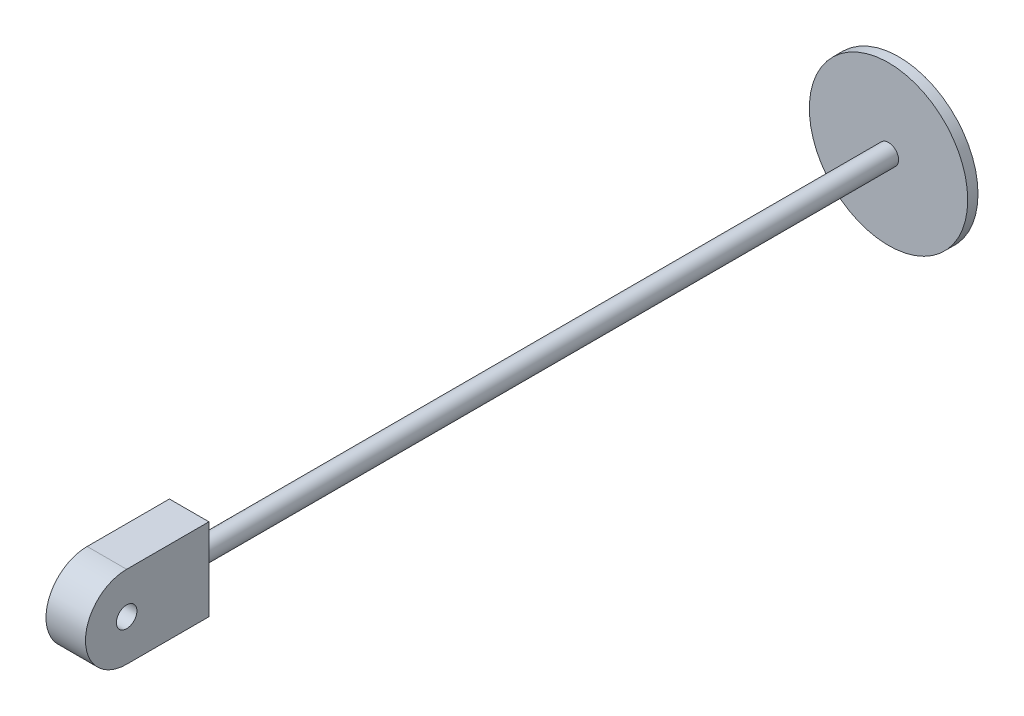
ISO-10303-21;
HEADER;
FILE_DESCRIPTION(('STEP AP214'),'2;1');
FILE_NAME('part.step','',(''),(''),'','','');
FILE_SCHEMA(('AUTOMOTIVE_DESIGN { 1 0 10303 214 1 1 1 1 }'));
ENDSEC;
DATA;
#1=APPLICATION_CONTEXT('core data for automotive mechanical design processes');
#2=APPLICATION_PROTOCOL_DEFINITION('international standard','automotive_design',2000,#1);
#3=PRODUCT_CONTEXT('',#1,'mechanical');
#4=PRODUCT('Part','Part','',(#3));
#5=PRODUCT_RELATED_PRODUCT_CATEGORY('part','',(#4));
#6=PRODUCT_DEFINITION_FORMATION('','',#4);
#7=PRODUCT_DEFINITION_CONTEXT('part definition',#1,'design');
#8=PRODUCT_DEFINITION('design','',#6,#7);
#9=PRODUCT_DEFINITION_SHAPE('','',#8);
#10=(LENGTH_UNIT() NAMED_UNIT(*) SI_UNIT(.MILLI.,.METRE.));
#11=(NAMED_UNIT(*) PLANE_ANGLE_UNIT() SI_UNIT($,.RADIAN.));
#12=(NAMED_UNIT(*) SI_UNIT($,.STERADIAN.) SOLID_ANGLE_UNIT());
#13=UNCERTAINTY_MEASURE_WITH_UNIT(LENGTH_MEASURE(1.E-05),#10,'distance_accuracy_value','');
#14=(GEOMETRIC_REPRESENTATION_CONTEXT(3) GLOBAL_UNCERTAINTY_ASSIGNED_CONTEXT((#13)) GLOBAL_UNIT_ASSIGNED_CONTEXT((#10,
#11,#12)) REPRESENTATION_CONTEXT('',''));
#15=CARTESIAN_POINT('',(0.,0.,0.));
#16=DIRECTION('',(0.,0.,1.));
#17=DIRECTION('',(1.,0.,0.));
#18=AXIS2_PLACEMENT_3D('',#15,#16,#17);
#19=CARTESIAN_POINT('',(0.,0.,0.625));
#20=DIRECTION('',(0.,0.,-1.));
#21=DIRECTION('',(-1.,0.,0.));
#22=AXIS2_PLACEMENT_3D('',#19,#20,#21);
#23=CYLINDRICAL_SURFACE('',#22,9.625);
#24=CARTESIAN_POINT('',(0.,0.,0.625));
#25=DIRECTION('',(0.,0.,1.));
#26=DIRECTION('',(1.,0.,0.));
#27=AXIS2_PLACEMENT_3D('',#24,#25,#26);
#28=CIRCLE('',#27,9.625);
#29=CARTESIAN_POINT('',(9.625,0.,0.625));
#30=VERTEX_POINT('',#29);
#31=EDGE_CURVE('E11',#30,#30,#28,.T.);
#32=ORIENTED_EDGE('',*,*,#31,.F.);
#33=EDGE_LOOP('',(#32));
#34=FACE_BOUND('',#33,.T.);
#35=CARTESIAN_POINT('',(0.,0.,-0.625));
#36=DIRECTION('',(0.,0.,1.));
#37=DIRECTION('',(1.,0.,0.));
#38=AXIS2_PLACEMENT_3D('',#35,#36,#37);
#39=CIRCLE('',#38,9.625);
#40=CARTESIAN_POINT('',(9.625,0.,-0.625));
#41=VERTEX_POINT('',#40);
#42=EDGE_CURVE('E36',#41,#41,#39,.T.);
#43=ORIENTED_EDGE('',*,*,#42,.T.);
#44=EDGE_LOOP('',(#43));
#45=FACE_BOUND('',#44,.T.);
#46=ADVANCED_FACE('F33',(#34,#45),#23,.T.);
#47=CARTESIAN_POINT('',(0.,0.,0.625));
#48=DIRECTION('',(0.,0.,1.));
#49=DIRECTION('',(1.,0.,0.));
#50=AXIS2_PLACEMENT_3D('',#47,#48,#49);
#51=PLANE('',#50);
#52=CARTESIAN_POINT('',(0.,0.,0.625));
#53=DIRECTION('',(0.,0.,1.));
#54=DIRECTION('',(1.,0.,0.));
#55=AXIS2_PLACEMENT_3D('',#52,#53,#54);
#56=CIRCLE('',#55,1.225);
#57=CARTESIAN_POINT('',(1.225,0.,0.625));
#58=VERTEX_POINT('',#57);
#59=EDGE_CURVE('E110',#58,#58,#56,.T.);
#60=ORIENTED_EDGE('',*,*,#59,.F.);
#61=EDGE_LOOP('',(#60));
#62=FACE_BOUND('',#61,.T.);
#63=ORIENTED_EDGE('',*,*,#31,.T.);
#64=EDGE_LOOP('',(#63));
#65=FACE_BOUND('',#64,.T.);
#66=ADVANCED_FACE('F119',(#62,#65),#51,.T.);
#67=CARTESIAN_POINT('',(0.,0.,-0.625));
#68=DIRECTION('',(0.,0.,1.));
#69=DIRECTION('',(1.,0.,0.));
#70=AXIS2_PLACEMENT_3D('',#67,#68,#69);
#71=PLANE('',#70);
#72=ORIENTED_EDGE('',*,*,#42,.F.);
#73=EDGE_LOOP('',(#72));
#74=FACE_BOUND('',#73,.T.);
#75=ADVANCED_FACE('F122',(#74),#71,.F.);
#76=CARTESIAN_POINT('',(0.,0.,85.625));
#77=DIRECTION('',(0.,0.,-1.));
#78=DIRECTION('',(-1.,0.,0.));
#79=AXIS2_PLACEMENT_3D('',#76,#77,#78);
#80=CYLINDRICAL_SURFACE('',#79,1.225);
#81=CARTESIAN_POINT('',(0.,0.,85.625));
#82=DIRECTION('',(0.,0.,1.));
#83=DIRECTION('',(1.,0.,0.));
#84=AXIS2_PLACEMENT_3D('',#81,#82,#83);
#85=CIRCLE('',#84,1.225);
#86=CARTESIAN_POINT('',(1.225,0.,85.625));
#87=VERTEX_POINT('',#86);
#88=EDGE_CURVE('E111',#87,#87,#85,.T.);
#89=ORIENTED_EDGE('',*,*,#88,.F.);
#90=EDGE_LOOP('',(#89));
#91=FACE_BOUND('',#90,.T.);
#92=ORIENTED_EDGE('',*,*,#59,.T.);
#93=EDGE_LOOP('',(#92));
#94=FACE_BOUND('',#93,.T.);
#95=ADVANCED_FACE('F117',(#91,#94),#80,.T.);
#96=CARTESIAN_POINT('',(2.4,5.,85.625));
#97=DIRECTION('',(0.,-1.,0.));
#98=DIRECTION('',(0.,0.,-1.));
#99=AXIS2_PLACEMENT_3D('',#96,#97,#98);
#100=PLANE('',#99);
#101=DIRECTION('',(0.,0.,1.));
#102=VECTOR('',#101,1.);
#103=CARTESIAN_POINT('',(-2.4,5.,85.625));
#104=LINE('',#103,#102);
#105=CARTESIAN_POINT('',(-2.4,5.,85.625));
#106=VERTEX_POINT('',#105);
#107=CARTESIAN_POINT('',(-2.4,4.99999999999999,95.625));
#108=VERTEX_POINT('',#107);
#109=EDGE_CURVE('E100',#106,#108,#104,.T.);
#110=ORIENTED_EDGE('',*,*,#109,.T.);
#111=DIRECTION('',(-1.,0.,0.));
#112=VECTOR('',#111,1.);
#113=CARTESIAN_POINT('',(2.4,4.99999999999999,95.625));
#114=LINE('',#113,#112);
#115=CARTESIAN_POINT('',(2.4,4.99999999999999,95.625));
#116=VERTEX_POINT('',#115);
#117=EDGE_CURVE('E91',#116,#108,#114,.T.);
#118=ORIENTED_EDGE('',*,*,#117,.F.);
#119=DIRECTION('',(0.,0.,1.));
#120=VECTOR('',#119,1.);
#121=CARTESIAN_POINT('',(2.4,5.,85.625));
#122=LINE('',#121,#120);
#123=CARTESIAN_POINT('',(2.4,5.,85.625));
#124=VERTEX_POINT('',#123);
#125=EDGE_CURVE('E85',#124,#116,#122,.T.);
#126=ORIENTED_EDGE('',*,*,#125,.F.);
#127=DIRECTION('',(-1.,0.,0.));
#128=VECTOR('',#127,1.);
#129=CARTESIAN_POINT('',(2.4,5.,85.625));
#130=LINE('',#129,#128);
#131=EDGE_CURVE('E96',#124,#106,#130,.T.);
#132=ORIENTED_EDGE('',*,*,#131,.T.);
#133=EDGE_LOOP('',(#110,#118,#126,#132));
#134=FACE_BOUND('',#133,.T.);
#135=ADVANCED_FACE('F135',(#134),#100,.F.);
#136=CARTESIAN_POINT('',(2.4,0.,95.625));
#137=DIRECTION('',(-1.,0.,0.));
#138=DIRECTION('',(0.,0.,1.));
#139=AXIS2_PLACEMENT_3D('',#136,#137,#138);
#140=CYLINDRICAL_SURFACE('',#139,5.);
#141=CARTESIAN_POINT('',(-2.4,0.,95.625));
#142=DIRECTION('',(1.,0.,0.));
#143=DIRECTION('',(0.,0.,-1.));
#144=AXIS2_PLACEMENT_3D('',#141,#142,#143);
#145=CIRCLE('',#144,5.);
#146=CARTESIAN_POINT('',(-2.4,-5.,95.625));
#147=VERTEX_POINT('',#146);
#148=EDGE_CURVE('E90',#108,#147,#145,.T.);
#149=ORIENTED_EDGE('',*,*,#148,.T.);
#150=DIRECTION('',(-1.,0.,0.));
#151=VECTOR('',#150,1.);
#152=CARTESIAN_POINT('',(2.4,-5.,95.625));
#153=LINE('',#152,#151);
#154=CARTESIAN_POINT('',(2.4,-5.,95.625));
#155=VERTEX_POINT('',#154);
#156=EDGE_CURVE('E88',#155,#147,#153,.T.);
#157=ORIENTED_EDGE('',*,*,#156,.F.);
#158=CARTESIAN_POINT('',(2.4,0.,95.625));
#159=DIRECTION('',(1.,0.,0.));
#160=DIRECTION('',(0.,0.,-1.));
#161=AXIS2_PLACEMENT_3D('',#158,#159,#160);
#162=CIRCLE('',#161,5.);
#163=EDGE_CURVE('E80',#116,#155,#162,.T.);
#164=ORIENTED_EDGE('',*,*,#163,.F.);
#165=ORIENTED_EDGE('',*,*,#117,.T.);
#166=EDGE_LOOP('',(#149,#157,#164,#165));
#167=FACE_BOUND('',#166,.T.);
#168=ADVANCED_FACE('F89',(#167),#140,.T.);
#169=CARTESIAN_POINT('',(2.4,-5.,95.625));
#170=DIRECTION('',(0.,1.,0.));
#171=DIRECTION('',(0.,0.,1.));
#172=AXIS2_PLACEMENT_3D('',#169,#170,#171);
#173=PLANE('',#172);
#174=DIRECTION('',(0.,0.,-1.));
#175=VECTOR('',#174,1.);
#176=CARTESIAN_POINT('',(-2.4,-5.,95.625));
#177=LINE('',#176,#175);
#178=CARTESIAN_POINT('',(-2.4,-5.,85.625));
#179=VERTEX_POINT('',#178);
#180=EDGE_CURVE('E66',#147,#179,#177,.T.);
#181=ORIENTED_EDGE('',*,*,#180,.T.);
#182=DIRECTION('',(-1.,0.,0.));
#183=VECTOR('',#182,1.);
#184=CARTESIAN_POINT('',(2.4,-5.,85.625));
#185=LINE('',#184,#183);
#186=CARTESIAN_POINT('',(2.4,-5.,85.625));
#187=VERTEX_POINT('',#186);
#188=EDGE_CURVE('E92',#187,#179,#185,.T.);
#189=ORIENTED_EDGE('',*,*,#188,.F.);
#190=DIRECTION('',(0.,0.,-1.));
#191=VECTOR('',#190,1.);
#192=CARTESIAN_POINT('',(2.4,-5.,95.625));
#193=LINE('',#192,#191);
#194=EDGE_CURVE('E83',#155,#187,#193,.T.);
#195=ORIENTED_EDGE('',*,*,#194,.F.);
#196=ORIENTED_EDGE('',*,*,#156,.T.);
#197=EDGE_LOOP('',(#181,#189,#195,#196));
#198=FACE_BOUND('',#197,.T.);
#199=ADVANCED_FACE('F94',(#198),#173,.F.);
#200=CARTESIAN_POINT('',(2.4,5.,85.625));
#201=DIRECTION('',(0.,0.,1.));
#202=DIRECTION('',(1.,0.,0.));
#203=AXIS2_PLACEMENT_3D('',#200,#201,#202);
#204=PLANE('',#203);
#205=ORIENTED_EDGE('',*,*,#88,.T.);
#206=EDGE_LOOP('',(#205));
#207=FACE_BOUND('',#206,.T.);
#208=DIRECTION('',(0.,1.,0.));
#209=VECTOR('',#208,1.);
#210=CARTESIAN_POINT('',(-2.4,5.,85.625));
#211=LINE('',#210,#209);
#212=EDGE_CURVE('E72',#179,#106,#211,.T.);
#213=ORIENTED_EDGE('',*,*,#212,.T.);
#214=ORIENTED_EDGE('',*,*,#131,.F.);
#215=DIRECTION('',(0.,1.,0.));
#216=VECTOR('',#215,1.);
#217=CARTESIAN_POINT('',(2.4,5.,85.625));
#218=LINE('',#217,#216);
#219=EDGE_CURVE('E49',#187,#124,#218,.T.);
#220=ORIENTED_EDGE('',*,*,#219,.F.);
#221=ORIENTED_EDGE('',*,*,#188,.T.);
#222=EDGE_LOOP('',(#213,#214,#220,#221));
#223=FACE_BOUND('',#222,.T.);
#224=ADVANCED_FACE('F146',(#207,#223),#204,.F.);
#225=CARTESIAN_POINT('',(2.4,0.,95.625));
#226=DIRECTION('',(1.,0.,0.));
#227=DIRECTION('',(0.,0.,-1.));
#228=AXIS2_PLACEMENT_3D('',#225,#226,#227);
#229=PLANE('',#228);
#230=CARTESIAN_POINT('',(2.4,0.,95.625));
#231=DIRECTION('',(1.,0.,0.));
#232=DIRECTION('',(0.,0.,-1.));
#233=AXIS2_PLACEMENT_3D('',#230,#231,#232);
#234=CIRCLE('',#233,1.25);
#235=CARTESIAN_POINT('',(2.4,0.,94.375));
#236=VERTEX_POINT('',#235);
#237=EDGE_CURVE('E103',#236,#236,#234,.T.);
#238=ORIENTED_EDGE('',*,*,#237,.F.);
#239=EDGE_LOOP('',(#238));
#240=FACE_BOUND('',#239,.T.);
#241=ORIENTED_EDGE('',*,*,#125,.T.);
#242=ORIENTED_EDGE('',*,*,#163,.T.);
#243=ORIENTED_EDGE('',*,*,#194,.T.);
#244=ORIENTED_EDGE('',*,*,#219,.T.);
#245=EDGE_LOOP('',(#241,#242,#243,#244));
#246=FACE_BOUND('',#245,.T.);
#247=ADVANCED_FACE('F81',(#240,#246),#229,.T.);
#248=CARTESIAN_POINT('',(-2.4,0.,95.625));
#249=DIRECTION('',(1.,0.,0.));
#250=DIRECTION('',(0.,0.,-1.));
#251=AXIS2_PLACEMENT_3D('',#248,#249,#250);
#252=PLANE('',#251);
#253=CARTESIAN_POINT('',(-2.4,0.,95.625));
#254=DIRECTION('',(-1.,0.,0.));
#255=DIRECTION('',(0.,0.,1.));
#256=AXIS2_PLACEMENT_3D('',#253,#254,#255);
#257=CIRCLE('',#256,1.25);
#258=CARTESIAN_POINT('',(-2.4,0.,96.875));
#259=VERTEX_POINT('',#258);
#260=EDGE_CURVE('E167',#259,#259,#257,.T.);
#261=ORIENTED_EDGE('',*,*,#260,.F.);
#262=EDGE_LOOP('',(#261));
#263=FACE_BOUND('',#262,.T.);
#264=ORIENTED_EDGE('',*,*,#109,.F.);
#265=ORIENTED_EDGE('',*,*,#212,.F.);
#266=ORIENTED_EDGE('',*,*,#180,.F.);
#267=ORIENTED_EDGE('',*,*,#148,.F.);
#268=EDGE_LOOP('',(#264,#265,#266,#267));
#269=FACE_BOUND('',#268,.T.);
#270=ADVANCED_FACE('F150',(#263,#269),#252,.F.);
#271=CARTESIAN_POINT('',(7.6,0.,95.625));
#272=DIRECTION('',(-1.,0.,0.));
#273=DIRECTION('',(0.,0.,1.));
#274=AXIS2_PLACEMENT_3D('',#271,#272,#273);
#275=CYLINDRICAL_SURFACE('',#274,1.25);
#276=ORIENTED_EDGE('',*,*,#237,.T.);
#277=EDGE_LOOP('',(#276));
#278=FACE_BOUND('',#277,.T.);
#279=ORIENTED_EDGE('',*,*,#260,.T.);
#280=EDGE_LOOP('',(#279));
#281=FACE_BOUND('',#280,.T.);
#282=ADVANCED_FACE('F153',(#278,#281),#275,.F.);
#283=CLOSED_SHELL('',(#46,#66,#75,#95,#135,#168,#199,#224,#247,#270,#282));
#284=MANIFOLD_SOLID_BREP('B2',#283);
#285=ADVANCED_BREP_SHAPE_REPRESENTATION('',(#18,#284),#14);
#286=SHAPE_DEFINITION_REPRESENTATION(#9,#285);
ENDSEC;
END-ISO-10303-21;
